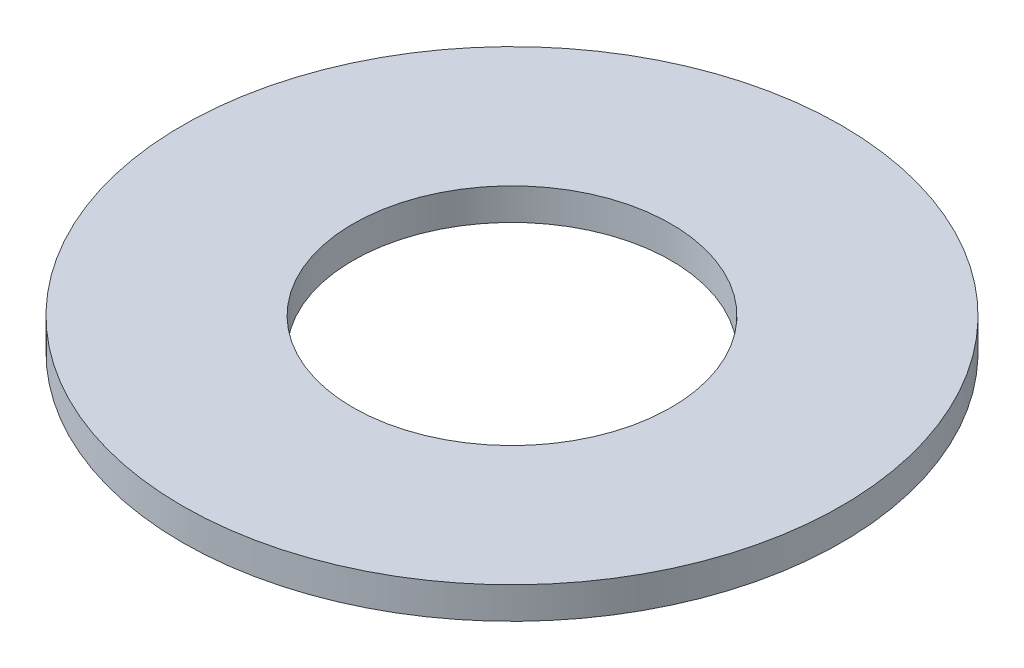
ISO-10303-21;
HEADER;
FILE_DESCRIPTION(('STEP AP214'),'2;1');
FILE_NAME('part.step','',(''),(''),'','','');
FILE_SCHEMA(('AUTOMOTIVE_DESIGN { 1 0 10303 214 1 1 1 1 }'));
ENDSEC;
DATA;
#1=APPLICATION_CONTEXT('core data for automotive mechanical design processes');
#2=APPLICATION_PROTOCOL_DEFINITION('international standard','automotive_design',2000,#1);
#3=PRODUCT_CONTEXT('',#1,'mechanical');
#4=PRODUCT('Part','Part','',(#3));
#5=PRODUCT_RELATED_PRODUCT_CATEGORY('part','',(#4));
#6=PRODUCT_DEFINITION_FORMATION('','',#4);
#7=PRODUCT_DEFINITION_CONTEXT('part definition',#1,'design');
#8=PRODUCT_DEFINITION('design','',#6,#7);
#9=PRODUCT_DEFINITION_SHAPE('','',#8);
#10=(LENGTH_UNIT() NAMED_UNIT(*) SI_UNIT(.MILLI.,.METRE.));
#11=(NAMED_UNIT(*) PLANE_ANGLE_UNIT() SI_UNIT($,.RADIAN.));
#12=(NAMED_UNIT(*) SI_UNIT($,.STERADIAN.) SOLID_ANGLE_UNIT());
#13=UNCERTAINTY_MEASURE_WITH_UNIT(LENGTH_MEASURE(1.E-05),#10,'distance_accuracy_value','');
#14=(GEOMETRIC_REPRESENTATION_CONTEXT(3) GLOBAL_UNCERTAINTY_ASSIGNED_CONTEXT((#13)) GLOBAL_UNIT_ASSIGNED_CONTEXT((#10,
#11,#12)) REPRESENTATION_CONTEXT('',''));
#15=CARTESIAN_POINT('',(0.,0.,0.));
#16=DIRECTION('',(0.,0.,1.));
#17=DIRECTION('',(1.,0.,0.));
#18=AXIS2_PLACEMENT_3D('',#15,#16,#17);
#19=CARTESIAN_POINT('',(0.,6.35,0.));
#20=DIRECTION('',(0.,-1.,0.));
#21=DIRECTION('',(0.,0.,-1.));
#22=AXIS2_PLACEMENT_3D('',#19,#20,#21);
#23=CYLINDRICAL_SURFACE('',#22,66.04);
#24=CARTESIAN_POINT('',(0.,6.35,0.));
#25=DIRECTION('',(0.,1.,0.));
#26=DIRECTION('',(0.,0.,1.));
#27=AXIS2_PLACEMENT_3D('',#24,#25,#26);
#28=CIRCLE('',#27,66.04);
#29=CARTESIAN_POINT('',(0.,6.35,66.04));
#30=VERTEX_POINT('',#29);
#31=EDGE_CURVE('E10',#30,#30,#28,.T.);
#32=ORIENTED_EDGE('',*,*,#31,.F.);
#33=EDGE_LOOP('',(#32));
#34=FACE_BOUND('',#33,.T.);
#35=CARTESIAN_POINT('',(0.,0.,0.));
#36=DIRECTION('',(0.,1.,0.));
#37=DIRECTION('',(0.,0.,1.));
#38=AXIS2_PLACEMENT_3D('',#35,#36,#37);
#39=CIRCLE('',#38,66.04);
#40=CARTESIAN_POINT('',(0.,0.,66.04));
#41=VERTEX_POINT('',#40);
#42=EDGE_CURVE('E34',#41,#41,#39,.T.);
#43=ORIENTED_EDGE('',*,*,#42,.T.);
#44=EDGE_LOOP('',(#43));
#45=FACE_BOUND('',#44,.T.);
#46=ADVANCED_FACE('F31',(#34,#45),#23,.T.);
#47=CARTESIAN_POINT('',(0.,6.35,0.));
#48=DIRECTION('',(0.,1.,0.));
#49=DIRECTION('',(0.,0.,1.));
#50=AXIS2_PLACEMENT_3D('',#47,#48,#49);
#51=PLANE('',#50);
#52=CARTESIAN_POINT('',(0.,6.35,0.));
#53=DIRECTION('',(0.,1.,0.));
#54=DIRECTION('',(0.,0.,1.));
#55=AXIS2_PLACEMENT_3D('',#52,#53,#54);
#56=CIRCLE('',#55,31.877);
#57=CARTESIAN_POINT('',(0.,6.35,31.877));
#58=VERTEX_POINT('',#57);
#59=EDGE_CURVE('E43',#58,#58,#56,.T.);
#60=ORIENTED_EDGE('',*,*,#59,.F.);
#61=EDGE_LOOP('',(#60));
#62=FACE_BOUND('',#61,.T.);
#63=ORIENTED_EDGE('',*,*,#31,.T.);
#64=EDGE_LOOP('',(#63));
#65=FACE_BOUND('',#64,.T.);
#66=ADVANCED_FACE('F58',(#62,#65),#51,.T.);
#67=CARTESIAN_POINT('',(0.,0.,0.));
#68=DIRECTION('',(0.,1.,0.));
#69=DIRECTION('',(0.,0.,1.));
#70=AXIS2_PLACEMENT_3D('',#67,#68,#69);
#71=PLANE('',#70);
#72=CARTESIAN_POINT('',(0.,0.,0.));
#73=DIRECTION('',(0.,1.,0.));
#74=DIRECTION('',(0.,0.,1.));
#75=AXIS2_PLACEMENT_3D('',#72,#73,#74);
#76=CIRCLE('',#75,31.877);
#77=CARTESIAN_POINT('',(0.,0.,31.877));
#78=VERTEX_POINT('',#77);
#79=EDGE_CURVE('E41',#78,#78,#76,.T.);
#80=ORIENTED_EDGE('',*,*,#79,.T.);
#81=EDGE_LOOP('',(#80));
#82=FACE_BOUND('',#81,.T.);
#83=ORIENTED_EDGE('',*,*,#42,.F.);
#84=EDGE_LOOP('',(#83));
#85=FACE_BOUND('',#84,.T.);
#86=ADVANCED_FACE('F49',(#82,#85),#71,.F.);
#87=CARTESIAN_POINT('',(0.,0.,0.));
#88=DIRECTION('',(0.,1.,0.));
#89=DIRECTION('',(0.,0.,1.));
#90=AXIS2_PLACEMENT_3D('',#87,#88,#89);
#91=CYLINDRICAL_SURFACE('',#90,31.877);
#92=ORIENTED_EDGE('',*,*,#79,.F.);
#93=EDGE_LOOP('',(#92));
#94=FACE_BOUND('',#93,.T.);
#95=ORIENTED_EDGE('',*,*,#59,.T.);
#96=EDGE_LOOP('',(#95));
#97=FACE_BOUND('',#96,.T.);
#98=ADVANCED_FACE('F52',(#94,#97),#91,.F.);
#99=CLOSED_SHELL('',(#46,#66,#86,#98));
#100=MANIFOLD_SOLID_BREP('B2',#99);
#101=ADVANCED_BREP_SHAPE_REPRESENTATION('',(#18,#100),#14);
#102=SHAPE_DEFINITION_REPRESENTATION(#9,#101);
ENDSEC;
END-ISO-10303-21;
